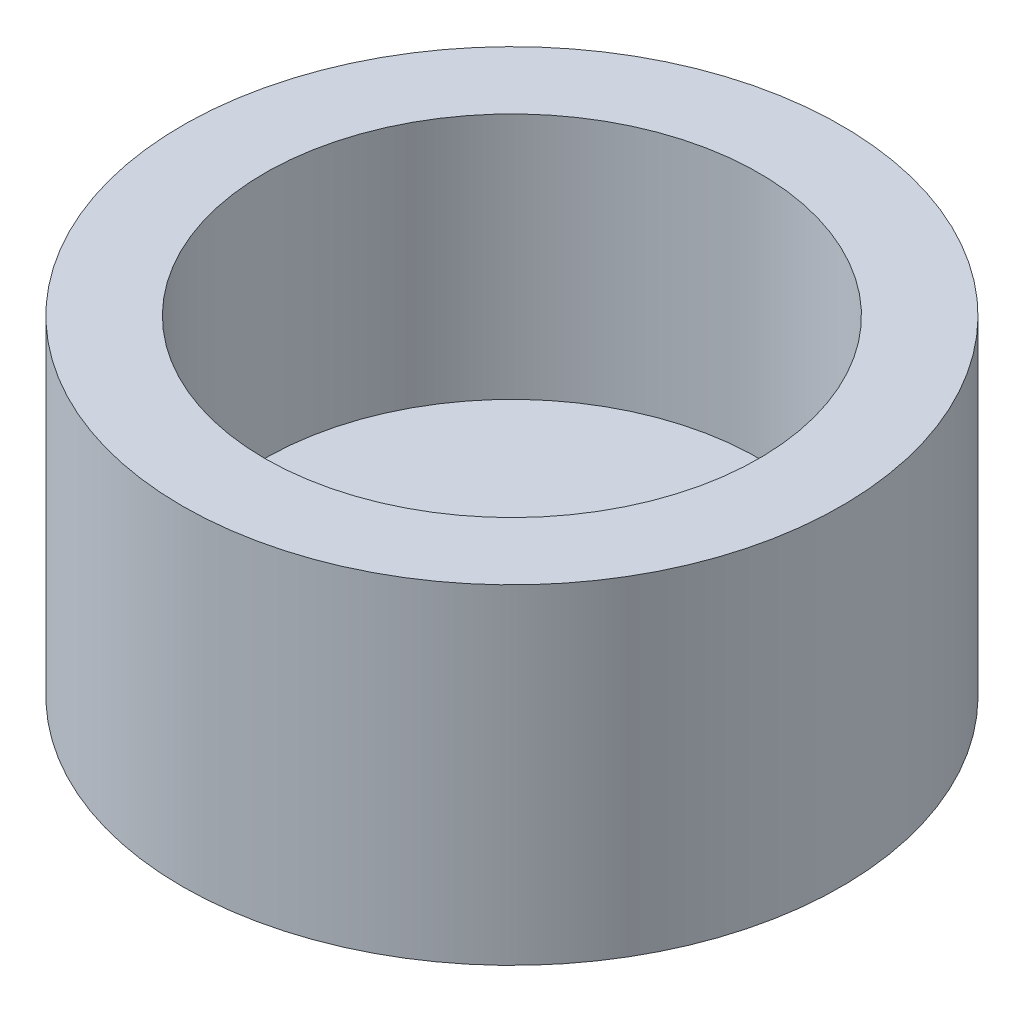
ISO-10303-21;
HEADER;
FILE_DESCRIPTION(('STEP AP214'),'2;1');
FILE_NAME('part.step','',(''),(''),'','','');
FILE_SCHEMA(('AUTOMOTIVE_DESIGN { 1 0 10303 214 1 1 1 1 }'));
ENDSEC;
DATA;
#1=APPLICATION_CONTEXT('core data for automotive mechanical design processes');
#2=APPLICATION_PROTOCOL_DEFINITION('international standard','automotive_design',2000,#1);
#3=PRODUCT_CONTEXT('',#1,'mechanical');
#4=PRODUCT('Part','Part','',(#3));
#5=PRODUCT_RELATED_PRODUCT_CATEGORY('part','',(#4));
#6=PRODUCT_DEFINITION_FORMATION('','',#4);
#7=PRODUCT_DEFINITION_CONTEXT('part definition',#1,'design');
#8=PRODUCT_DEFINITION('design','',#6,#7);
#9=PRODUCT_DEFINITION_SHAPE('','',#8);
#10=(LENGTH_UNIT() NAMED_UNIT(*) SI_UNIT(.MILLI.,.METRE.));
#11=(NAMED_UNIT(*) PLANE_ANGLE_UNIT() SI_UNIT($,.RADIAN.));
#12=(NAMED_UNIT(*) SI_UNIT($,.STERADIAN.) SOLID_ANGLE_UNIT());
#13=UNCERTAINTY_MEASURE_WITH_UNIT(LENGTH_MEASURE(1.E-05),#10,'distance_accuracy_value','');
#14=(GEOMETRIC_REPRESENTATION_CONTEXT(3) GLOBAL_UNCERTAINTY_ASSIGNED_CONTEXT((#13)) GLOBAL_UNIT_ASSIGNED_CONTEXT((#10,
#11,#12)) REPRESENTATION_CONTEXT('',''));
#15=CARTESIAN_POINT('',(0.,0.,0.));
#16=DIRECTION('',(0.,0.,1.));
#17=DIRECTION('',(1.,0.,0.));
#18=AXIS2_PLACEMENT_3D('',#15,#16,#17);
#19=CARTESIAN_POINT('',(0.,0.,0.));
#20=DIRECTION('',(0.,1.,0.));
#21=DIRECTION('',(0.,0.,1.));
#22=AXIS2_PLACEMENT_3D('',#19,#20,#21);
#23=PLANE('',#22);
#24=CARTESIAN_POINT('',(0.,0.,0.));
#25=DIRECTION('',(0.,1.,0.));
#26=DIRECTION('',(0.,0.,1.));
#27=AXIS2_PLACEMENT_3D('',#24,#25,#26);
#28=CIRCLE('',#27,3.3782);
#29=CARTESIAN_POINT('',(0.,0.,3.3782));
#30=VERTEX_POINT('',#29);
#31=EDGE_CURVE('E52',#30,#30,#28,.T.);
#32=ORIENTED_EDGE('',*,*,#31,.T.);
#33=EDGE_LOOP('',(#32));
#34=FACE_BOUND('',#33,.T.);
#35=CARTESIAN_POINT('',(0.,0.,0.));
#36=DIRECTION('',(0.,1.,0.));
#37=DIRECTION('',(0.,0.,1.));
#38=AXIS2_PLACEMENT_3D('',#35,#36,#37);
#39=CIRCLE('',#38,25.4);
#40=CARTESIAN_POINT('',(0.,0.,25.4));
#41=VERTEX_POINT('',#40);
#42=EDGE_CURVE('E10',#41,#41,#39,.T.);
#43=ORIENTED_EDGE('',*,*,#42,.F.);
#44=EDGE_LOOP('',(#43));
#45=FACE_BOUND('',#44,.T.);
#46=ADVANCED_FACE('F33',(#34,#45),#23,.F.);
#47=CARTESIAN_POINT('',(0.,6.35,0.));
#48=DIRECTION('',(0.,1.,0.));
#49=DIRECTION('',(0.,0.,1.));
#50=AXIS2_PLACEMENT_3D('',#47,#48,#49);
#51=CYLINDRICAL_SURFACE('',#50,25.4);
#52=CARTESIAN_POINT('',(0.,25.4,0.));
#53=DIRECTION('',(0.,1.,0.));
#54=DIRECTION('',(0.,0.,1.));
#55=AXIS2_PLACEMENT_3D('',#52,#53,#54);
#56=CIRCLE('',#55,25.4);
#57=CARTESIAN_POINT('',(0.,25.4,25.4));
#58=VERTEX_POINT('',#57);
#59=EDGE_CURVE('E39',#58,#58,#56,.T.);
#60=ORIENTED_EDGE('',*,*,#59,.F.);
#61=EDGE_LOOP('',(#60));
#62=FACE_BOUND('',#61,.T.);
#63=ORIENTED_EDGE('',*,*,#42,.T.);
#64=EDGE_LOOP('',(#63));
#65=FACE_BOUND('',#64,.T.);
#66=ADVANCED_FACE('F75',(#62,#65),#51,.T.);
#67=CARTESIAN_POINT('',(25.4,25.4,0.));
#68=DIRECTION('',(0.,-1.,0.));
#69=DIRECTION('',(0.,0.,-1.));
#70=AXIS2_PLACEMENT_3D('',#67,#68,#69);
#71=PLANE('',#70);
#72=CARTESIAN_POINT('',(0.,25.4,0.));
#73=DIRECTION('',(0.,1.,0.));
#74=DIRECTION('',(0.,0.,1.));
#75=AXIS2_PLACEMENT_3D('',#72,#73,#74);
#76=CIRCLE('',#75,19.05);
#77=CARTESIAN_POINT('',(0.,25.4,19.05));
#78=VERTEX_POINT('',#77);
#79=EDGE_CURVE('E43',#78,#78,#76,.T.);
#80=ORIENTED_EDGE('',*,*,#79,.F.);
#81=EDGE_LOOP('',(#80));
#82=FACE_BOUND('',#81,.T.);
#83=ORIENTED_EDGE('',*,*,#59,.T.);
#84=EDGE_LOOP('',(#83));
#85=FACE_BOUND('',#84,.T.);
#86=ADVANCED_FACE('F70',(#82,#85),#71,.F.);
#87=CARTESIAN_POINT('',(0.,6.35,0.));
#88=DIRECTION('',(0.,1.,0.));
#89=DIRECTION('',(0.,0.,1.));
#90=AXIS2_PLACEMENT_3D('',#87,#88,#89);
#91=CYLINDRICAL_SURFACE('',#90,19.05);
#92=CARTESIAN_POINT('',(0.,6.35,0.));
#93=DIRECTION('',(0.,1.,0.));
#94=DIRECTION('',(0.,0.,1.));
#95=AXIS2_PLACEMENT_3D('',#92,#93,#94);
#96=CIRCLE('',#95,19.05);
#97=CARTESIAN_POINT('',(0.,6.35,19.05));
#98=VERTEX_POINT('',#97);
#99=EDGE_CURVE('E47',#98,#98,#96,.T.);
#100=ORIENTED_EDGE('',*,*,#99,.F.);
#101=EDGE_LOOP('',(#100));
#102=FACE_BOUND('',#101,.T.);
#103=ORIENTED_EDGE('',*,*,#79,.T.);
#104=EDGE_LOOP('',(#103));
#105=FACE_BOUND('',#104,.T.);
#106=ADVANCED_FACE('F64',(#102,#105),#91,.F.);
#107=CARTESIAN_POINT('',(19.05,6.35,0.));
#108=DIRECTION('',(0.,-1.,0.));
#109=DIRECTION('',(0.,0.,-1.));
#110=AXIS2_PLACEMENT_3D('',#107,#108,#109);
#111=PLANE('',#110);
#112=CARTESIAN_POINT('',(0.,6.35,0.));
#113=DIRECTION('',(0.,1.,0.));
#114=DIRECTION('',(0.,0.,1.));
#115=AXIS2_PLACEMENT_3D('',#112,#113,#114);
#116=CIRCLE('',#115,3.3782);
#117=CARTESIAN_POINT('',(0.,6.35,3.3782));
#118=VERTEX_POINT('',#117);
#119=EDGE_CURVE('E55',#118,#118,#116,.T.);
#120=ORIENTED_EDGE('',*,*,#119,.F.);
#121=EDGE_LOOP('',(#120));
#122=FACE_BOUND('',#121,.T.);
#123=ORIENTED_EDGE('',*,*,#99,.T.);
#124=EDGE_LOOP('',(#123));
#125=FACE_BOUND('',#124,.T.);
#126=ADVANCED_FACE('F61',(#122,#125),#111,.F.);
#127=CARTESIAN_POINT('',(0.,6.35,0.));
#128=DIRECTION('',(0.,1.,0.));
#129=DIRECTION('',(0.,0.,1.));
#130=AXIS2_PLACEMENT_3D('',#127,#128,#129);
#131=CYLINDRICAL_SURFACE('',#130,3.3782);
#132=ORIENTED_EDGE('',*,*,#31,.F.);
#133=EDGE_LOOP('',(#132));
#134=FACE_BOUND('',#133,.T.);
#135=ORIENTED_EDGE('',*,*,#119,.T.);
#136=EDGE_LOOP('',(#135));
#137=FACE_BOUND('',#136,.T.);
#138=ADVANCED_FACE('F59',(#134,#137),#131,.F.);
#139=CLOSED_SHELL('',(#46,#66,#86,#106,#126,#138));
#140=MANIFOLD_SOLID_BREP('B2',#139);
#141=ADVANCED_BREP_SHAPE_REPRESENTATION('',(#18,#140),#14);
#142=SHAPE_DEFINITION_REPRESENTATION(#9,#141);
ENDSEC;
END-ISO-10303-21;
